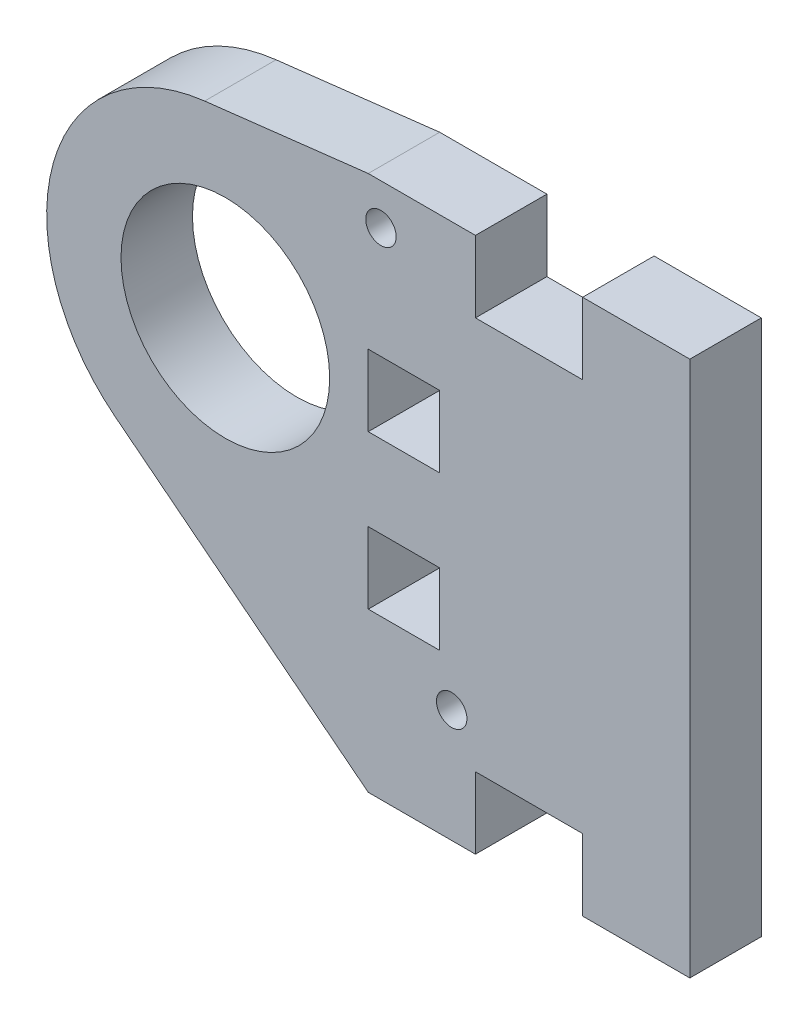
ISO-10303-21;
HEADER;
FILE_DESCRIPTION(('STEP AP214'),'2;1');
FILE_NAME('part.step','',(''),(''),'','','');
FILE_SCHEMA(('AUTOMOTIVE_DESIGN { 1 0 10303 214 1 1 1 1 }'));
ENDSEC;
DATA;
#1=APPLICATION_CONTEXT('core data for automotive mechanical design processes');
#2=APPLICATION_PROTOCOL_DEFINITION('international standard','automotive_design',2000,#1);
#3=PRODUCT_CONTEXT('',#1,'mechanical');
#4=PRODUCT('Part','Part','',(#3));
#5=PRODUCT_RELATED_PRODUCT_CATEGORY('part','',(#4));
#6=PRODUCT_DEFINITION_FORMATION('','',#4);
#7=PRODUCT_DEFINITION_CONTEXT('part definition',#1,'design');
#8=PRODUCT_DEFINITION('design','',#6,#7);
#9=PRODUCT_DEFINITION_SHAPE('','',#8);
#10=(LENGTH_UNIT() NAMED_UNIT(*) SI_UNIT(.MILLI.,.METRE.));
#11=(NAMED_UNIT(*) PLANE_ANGLE_UNIT() SI_UNIT($,.RADIAN.));
#12=(NAMED_UNIT(*) SI_UNIT($,.STERADIAN.) SOLID_ANGLE_UNIT());
#13=UNCERTAINTY_MEASURE_WITH_UNIT(LENGTH_MEASURE(1.E-05),#10,'distance_accuracy_value','');
#14=(GEOMETRIC_REPRESENTATION_CONTEXT(3) GLOBAL_UNCERTAINTY_ASSIGNED_CONTEXT((#13)) GLOBAL_UNIT_ASSIGNED_CONTEXT((#10,
#11,#12)) REPRESENTATION_CONTEXT('',''));
#15=CARTESIAN_POINT('',(0.,0.,0.));
#16=DIRECTION('',(0.,0.,1.));
#17=DIRECTION('',(1.,0.,0.));
#18=AXIS2_PLACEMENT_3D('',#15,#16,#17);
#19=CARTESIAN_POINT('',(3.34833341349612,-17.0927266242928,6.35));
#20=DIRECTION('',(0.,1.,0.));
#21=DIRECTION('',(-1.,0.,0.));
#22=AXIS2_PLACEMENT_3D('',#19,#20,#21);
#23=PLANE('',#22);
#24=DIRECTION('',(1.,0.,0.));
#25=VECTOR('',#24,1.);
#26=CARTESIAN_POINT('',(3.34833341349612,-17.0927266242928,6.35));
#27=LINE('',#26,#25);
#28=CARTESIAN_POINT('',(22.3983334134961,-17.0927266242928,6.35));
#29=VERTEX_POINT('',#28);
#30=CARTESIAN_POINT('',(31.9233334134961,-17.0927266242928,6.35));
#31=VERTEX_POINT('',#30);
#32=EDGE_CURVE('E327',#29,#31,#27,.T.);
#33=ORIENTED_EDGE('',*,*,#32,.F.);
#34=DIRECTION('',(0.,0.,-1.));
#35=VECTOR('',#34,1.);
#36=CARTESIAN_POINT('',(22.3983334134961,-17.0927266242928,6.35));
#37=LINE('',#36,#35);
#38=CARTESIAN_POINT('',(22.3983334134961,-17.0927266242928,0.));
#39=VERTEX_POINT('',#38);
#40=EDGE_CURVE('E279',#29,#39,#37,.T.);
#41=ORIENTED_EDGE('',*,*,#40,.T.);
#42=DIRECTION('',(1.,0.,0.));
#43=VECTOR('',#42,1.);
#44=CARTESIAN_POINT('',(3.34833341349612,-17.0927266242928,0.));
#45=LINE('',#44,#43);
#46=CARTESIAN_POINT('',(31.9233334134961,-17.0927266242928,0.));
#47=VERTEX_POINT('',#46);
#48=EDGE_CURVE('E344',#39,#47,#45,.T.);
#49=ORIENTED_EDGE('',*,*,#48,.T.);
#50=DIRECTION('',(0.,0.,-1.));
#51=VECTOR('',#50,1.);
#52=CARTESIAN_POINT('',(31.9233334134961,-17.0927266242928,6.35));
#53=LINE('',#52,#51);
#54=EDGE_CURVE('E331',#31,#47,#53,.T.);
#55=ORIENTED_EDGE('',*,*,#54,.F.);
#56=EDGE_LOOP('',(#33,#41,#49,#55));
#57=FACE_BOUND('',#56,.T.);
#58=ADVANCED_FACE('F39',(#57),#23,.F.);
#59=CARTESIAN_POINT('',(3.34833341349612,30.5322733757072,6.35));
#60=DIRECTION('',(0.,-1.,0.));
#61=DIRECTION('',(0.,0.,-1.));
#62=AXIS2_PLACEMENT_3D('',#59,#60,#61);
#63=PLANE('',#62);
#64=DIRECTION('',(-1.,0.,0.));
#65=VECTOR('',#64,1.);
#66=CARTESIAN_POINT('',(3.34833341349612,30.5322733757072,0.));
#67=LINE('',#66,#65);
#68=CARTESIAN_POINT('',(31.9233334134961,30.5322733757072,0.));
#69=VERTEX_POINT('',#68);
#70=CARTESIAN_POINT('',(22.3983334134961,30.5322733757072,0.));
#71=VERTEX_POINT('',#70);
#72=EDGE_CURVE('E335',#69,#71,#67,.T.);
#73=ORIENTED_EDGE('',*,*,#72,.T.);
#74=DIRECTION('',(0.,0.,1.));
#75=VECTOR('',#74,1.);
#76=CARTESIAN_POINT('',(22.3983334134961,30.5322733757072,6.35));
#77=LINE('',#76,#75);
#78=CARTESIAN_POINT('',(22.3983334134961,30.5322733757072,6.35));
#79=VERTEX_POINT('',#78);
#80=EDGE_CURVE('E303',#71,#79,#77,.T.);
#81=ORIENTED_EDGE('',*,*,#80,.T.);
#82=DIRECTION('',(-1.,0.,0.));
#83=VECTOR('',#82,1.);
#84=CARTESIAN_POINT('',(3.34833341349612,30.5322733757072,6.35));
#85=LINE('',#84,#83);
#86=CARTESIAN_POINT('',(31.9233334134961,30.5322733757072,6.35));
#87=VERTEX_POINT('',#86);
#88=EDGE_CURVE('E318',#87,#79,#85,.T.);
#89=ORIENTED_EDGE('',*,*,#88,.F.);
#90=DIRECTION('',(0.,0.,-1.));
#91=VECTOR('',#90,1.);
#92=CARTESIAN_POINT('',(31.9233334134961,30.5322733757072,6.35));
#93=LINE('',#92,#91);
#94=EDGE_CURVE('E361',#87,#69,#93,.T.);
#95=ORIENTED_EDGE('',*,*,#94,.T.);
#96=EDGE_LOOP('',(#73,#81,#89,#95));
#97=FACE_BOUND('',#96,.T.);
#98=ADVANCED_FACE('F393',(#97),#63,.F.);
#99=CARTESIAN_POINT('',(31.9233334134961,-17.0927266242928,6.35));
#100=DIRECTION('',(-1.,0.,0.));
#101=DIRECTION('',(0.,0.,1.));
#102=AXIS2_PLACEMENT_3D('',#99,#100,#101);
#103=PLANE('',#102);
#104=DIRECTION('',(0.,1.,0.));
#105=VECTOR('',#104,1.);
#106=CARTESIAN_POINT('',(31.9233334134961,-17.0927266242928,0.));
#107=LINE('',#106,#105);
#108=EDGE_CURVE('E310',#47,#69,#107,.T.);
#109=ORIENTED_EDGE('',*,*,#108,.T.);
#110=ORIENTED_EDGE('',*,*,#94,.F.);
#111=DIRECTION('',(0.,1.,0.));
#112=VECTOR('',#111,1.);
#113=CARTESIAN_POINT('',(31.9233334134961,-17.0927266242928,6.35));
#114=LINE('',#113,#112);
#115=EDGE_CURVE('E313',#31,#87,#114,.T.);
#116=ORIENTED_EDGE('',*,*,#115,.F.);
#117=ORIENTED_EDGE('',*,*,#54,.T.);
#118=EDGE_LOOP('',(#109,#110,#116,#117));
#119=FACE_BOUND('',#118,.T.);
#120=ADVANCED_FACE('F41',(#119),#103,.F.);
#121=CARTESIAN_POINT('',(12.8733334134961,30.5322733757072,6.35));
#122=VERTEX_POINT('',#121);
#123=CARTESIAN_POINT('',(3.34833341349612,30.5322733757072,6.35));
#124=VERTEX_POINT('',#123);
#125=EDGE_CURVE('E316',#122,#124,#85,.T.);
#126=ORIENTED_EDGE('',*,*,#125,.F.);
#127=DIRECTION('',(0.,0.,-1.));
#128=VECTOR('',#127,1.);
#129=CARTESIAN_POINT('',(12.8733334134961,30.5322733757072,6.35));
#130=LINE('',#129,#128);
#131=CARTESIAN_POINT('',(12.8733334134961,30.5322733757072,0.));
#132=VERTEX_POINT('',#131);
#133=EDGE_CURVE('E299',#122,#132,#130,.T.);
#134=ORIENTED_EDGE('',*,*,#133,.T.);
#135=CARTESIAN_POINT('',(3.34833341349612,30.5322733757072,0.));
#136=VERTEX_POINT('',#135);
#137=EDGE_CURVE('E334',#132,#136,#67,.T.);
#138=ORIENTED_EDGE('',*,*,#137,.T.);
#139=DIRECTION('',(0.,0.,-1.));
#140=VECTOR('',#139,1.);
#141=CARTESIAN_POINT('',(3.34833341349612,30.5322733757072,6.35));
#142=LINE('',#141,#140);
#143=EDGE_CURVE('E358',#124,#136,#142,.T.);
#144=ORIENTED_EDGE('',*,*,#143,.F.);
#145=EDGE_LOOP('',(#126,#134,#138,#144));
#146=FACE_BOUND('',#145,.T.);
#147=ADVANCED_FACE('F401',(#146),#63,.F.);
#148=CARTESIAN_POINT('',(3.34833341349612,30.5322733757072,6.35));
#149=DIRECTION('',(0.115756697460658,-0.993277598153206,0.));
#150=DIRECTION('',(0.993277598153206,0.115756697460658,0.));
#151=AXIS2_PLACEMENT_3D('',#148,#149,#150);
#152=PLANE('',#151);
#153=DIRECTION('',(-0.993277598153206,-0.115756697460658,0.));
#154=VECTOR('',#153,1.);
#155=CARTESIAN_POINT('',(3.34833341349612,30.5322733757072,0.));
#156=LINE('',#155,#154);
#157=CARTESIAN_POINT('',(-11.1893041586918,28.8380552463894,0.));
#158=VERTEX_POINT('',#157);
#159=EDGE_CURVE('E338',#136,#158,#156,.T.);
#160=ORIENTED_EDGE('',*,*,#159,.T.);
#161=DIRECTION('',(0.,0.,-1.));
#162=VECTOR('',#161,1.);
#163=CARTESIAN_POINT('',(-11.1893041586918,28.8380552463894,6.35));
#164=LINE('',#163,#162);
#165=CARTESIAN_POINT('',(-11.1893041586918,28.8380552463894,6.35));
#166=VERTEX_POINT('',#165);
#167=EDGE_CURVE('E355',#166,#158,#164,.T.);
#168=ORIENTED_EDGE('',*,*,#167,.F.);
#169=DIRECTION('',(-0.993277598153206,-0.115756697460658,0.));
#170=VECTOR('',#169,1.);
#171=CARTESIAN_POINT('',(3.34833341349612,30.5322733757072,6.35));
#172=LINE('',#171,#170);
#173=EDGE_CURVE('E321',#124,#166,#172,.T.);
#174=ORIENTED_EDGE('',*,*,#173,.F.);
#175=ORIENTED_EDGE('',*,*,#143,.T.);
#176=EDGE_LOOP('',(#160,#168,#174,#175));
#177=FACE_BOUND('',#176,.T.);
#178=ADVANCED_FACE('F441',(#177),#152,.F.);
#179=CARTESIAN_POINT('',(-9.35166658650387,13.0697733757072,6.35));
#180=DIRECTION('',(0.,0.,-1.));
#181=DIRECTION('',(-1.,0.,0.));
#182=AXIS2_PLACEMENT_3D('',#179,#180,#181);
#183=CYLINDRICAL_SURFACE('',#182,15.875);
#184=CARTESIAN_POINT('',(-9.35166658650387,13.0697733757072,0.));
#185=DIRECTION('',(0.,0.,1.));
#186=DIRECTION('',(1.,0.,0.));
#187=AXIS2_PLACEMENT_3D('',#184,#185,#186);
#188=CIRCLE('',#187,15.875);
#189=CARTESIAN_POINT('',(-19.1578360389959,0.585596764131632,0.));
#190=VERTEX_POINT('',#189);
#191=EDGE_CURVE('E340',#158,#190,#188,.T.);
#192=ORIENTED_EDGE('',*,*,#191,.T.);
#193=DIRECTION('',(0.,0.,-1.));
#194=VECTOR('',#193,1.);
#195=CARTESIAN_POINT('',(-19.1578360389959,0.585596764131632,6.35));
#196=LINE('',#195,#194);
#197=CARTESIAN_POINT('',(-19.1578360389959,0.585596764131632,6.35));
#198=VERTEX_POINT('',#197);
#199=EDGE_CURVE('E352',#198,#190,#196,.T.);
#200=ORIENTED_EDGE('',*,*,#199,.F.);
#201=CARTESIAN_POINT('',(-9.35166658650387,13.0697733757072,6.35));
#202=DIRECTION('',(0.,0.,1.));
#203=DIRECTION('',(1.,0.,0.));
#204=AXIS2_PLACEMENT_3D('',#201,#202,#203);
#205=CIRCLE('',#204,15.875);
#206=EDGE_CURVE('E323',#166,#198,#205,.T.);
#207=ORIENTED_EDGE('',*,*,#206,.F.);
#208=ORIENTED_EDGE('',*,*,#167,.T.);
#209=EDGE_LOOP('',(#192,#200,#207,#208));
#210=FACE_BOUND('',#209,.T.);
#211=ADVANCED_FACE('F414',(#210),#183,.T.);
#212=CARTESIAN_POINT('',(3.34833341349612,-17.0927266242928,6.35));
#213=DIRECTION('',(0.617711461574303,0.786404825926023,0.));
#214=DIRECTION('',(-0.786404825926023,0.617711461574303,0.));
#215=AXIS2_PLACEMENT_3D('',#212,#213,#214);
#216=PLANE('',#215);
#217=DIRECTION('',(0.786404825926023,-0.617711461574303,0.));
#218=VECTOR('',#217,1.);
#219=CARTESIAN_POINT('',(3.34833341349612,-17.0927266242928,0.));
#220=LINE('',#219,#218);
#221=CARTESIAN_POINT('',(3.34833341349612,-17.0927266242928,0.));
#222=VERTEX_POINT('',#221);
#223=EDGE_CURVE('E342',#190,#222,#220,.T.);
#224=ORIENTED_EDGE('',*,*,#223,.T.);
#225=DIRECTION('',(0.,0.,-1.));
#226=VECTOR('',#225,1.);
#227=CARTESIAN_POINT('',(3.34833341349612,-17.0927266242928,6.35));
#228=LINE('',#227,#226);
#229=CARTESIAN_POINT('',(3.34833341349612,-17.0927266242928,6.35));
#230=VERTEX_POINT('',#229);
#231=EDGE_CURVE('E349',#230,#222,#228,.T.);
#232=ORIENTED_EDGE('',*,*,#231,.F.);
#233=DIRECTION('',(0.786404825926023,-0.617711461574303,0.));
#234=VECTOR('',#233,1.);
#235=CARTESIAN_POINT('',(3.34833341349612,-17.0927266242928,6.35));
#236=LINE('',#235,#234);
#237=EDGE_CURVE('E325',#198,#230,#236,.T.);
#238=ORIENTED_EDGE('',*,*,#237,.F.);
#239=ORIENTED_EDGE('',*,*,#199,.T.);
#240=EDGE_LOOP('',(#224,#232,#238,#239));
#241=FACE_BOUND('',#240,.T.);
#242=ADVANCED_FACE('F406',(#241),#216,.F.);
#243=CARTESIAN_POINT('',(12.8733334134961,-17.0927266242928,0.));
#244=VERTEX_POINT('',#243);
#245=EDGE_CURVE('E317',#222,#244,#45,.T.);
#246=ORIENTED_EDGE('',*,*,#245,.T.);
#247=DIRECTION('',(0.,0.,1.));
#248=VECTOR('',#247,1.);
#249=CARTESIAN_POINT('',(12.8733334134961,-17.0927266242928,6.35));
#250=LINE('',#249,#248);
#251=CARTESIAN_POINT('',(12.8733334134961,-17.0927266242928,6.35));
#252=VERTEX_POINT('',#251);
#253=EDGE_CURVE('E274',#244,#252,#250,.T.);
#254=ORIENTED_EDGE('',*,*,#253,.T.);
#255=EDGE_CURVE('E328',#230,#252,#27,.T.);
#256=ORIENTED_EDGE('',*,*,#255,.F.);
#257=ORIENTED_EDGE('',*,*,#231,.T.);
#258=EDGE_LOOP('',(#246,#254,#256,#257));
#259=FACE_BOUND('',#258,.T.);
#260=ADVANCED_FACE('F396',(#259),#23,.F.);
#261=CARTESIAN_POINT('',(-9.35166658650387,13.0697733757072,6.35));
#262=DIRECTION('',(0.,0.,1.));
#263=DIRECTION('',(1.,0.,0.));
#264=AXIS2_PLACEMENT_3D('',#261,#262,#263);
#265=PLANE('',#264);
#266=DIRECTION('',(-1.,0.,0.));
#267=VECTOR('',#266,1.);
#268=CARTESIAN_POINT('',(9.69833341559938,-2.99416562889744,6.35000000011268));
#269=LINE('',#268,#267);
#270=CARTESIAN_POINT('',(9.69833341559938,-2.99416562889744,6.35000000011268));
#271=VERTEX_POINT('',#270);
#272=CARTESIAN_POINT('',(3.34833341559938,-2.99416562889744,6.35000000011268));
#273=VERTEX_POINT('',#272);
#274=EDGE_CURVE('E233',#271,#273,#269,.T.);
#275=ORIENTED_EDGE('',*,*,#274,.T.);
#276=DIRECTION('',(0.,1.,0.));
#277=VECTOR('',#276,1.);
#278=CARTESIAN_POINT('',(3.34833341559938,3.35583437110256,6.35000000011268));
#279=LINE('',#278,#277);
#280=CARTESIAN_POINT('',(3.34833341559938,3.35583437110256,6.35000000011268));
#281=VERTEX_POINT('',#280);
#282=EDGE_CURVE('E235',#273,#281,#279,.T.);
#283=ORIENTED_EDGE('',*,*,#282,.T.);
#284=DIRECTION('',(-1.,0.,0.));
#285=VECTOR('',#284,1.);
#286=CARTESIAN_POINT('',(9.69833341559938,3.35583437110256,6.35000000011268));
#287=LINE('',#286,#285);
#288=CARTESIAN_POINT('',(9.69833341559938,3.35583437110256,6.35));
#289=VERTEX_POINT('',#288);
#290=EDGE_CURVE('E239',#289,#281,#287,.T.);
#291=ORIENTED_EDGE('',*,*,#290,.F.);
#292=DIRECTION('',(0.,1.,0.));
#293=VECTOR('',#292,1.);
#294=CARTESIAN_POINT('',(9.69833341559938,3.35583437110256,6.35000000011268));
#295=LINE('',#294,#293);
#296=EDGE_CURVE('E54',#271,#289,#295,.T.);
#297=ORIENTED_EDGE('',*,*,#296,.F.);
#298=EDGE_LOOP('',(#275,#283,#291,#297));
#299=FACE_BOUND('',#298,.T.);
#300=DIRECTION('',(-1.,0.,0.));
#301=VECTOR('',#300,1.);
#302=CARTESIAN_POINT('',(9.69833341559938,17.0128062099298,6.35000000011271));
#303=LINE('',#302,#301);
#304=CARTESIAN_POINT('',(9.69833341559938,17.0128062099298,6.35000000011271));
#305=VERTEX_POINT('',#304);
#306=CARTESIAN_POINT('',(3.34833341559938,17.0128062099298,6.35000000011271));
#307=VERTEX_POINT('',#306);
#308=EDGE_CURVE('E209',#305,#307,#303,.T.);
#309=ORIENTED_EDGE('',*,*,#308,.F.);
#310=DIRECTION('',(0.,1.,0.));
#311=VECTOR('',#310,1.);
#312=CARTESIAN_POINT('',(9.69833341559938,10.6628062099298,6.35000000011271));
#313=LINE('',#312,#311);
#314=CARTESIAN_POINT('',(9.69833341559938,10.6628062099298,6.35000000011271));
#315=VERTEX_POINT('',#314);
#316=EDGE_CURVE('E196',#315,#305,#313,.T.);
#317=ORIENTED_EDGE('',*,*,#316,.F.);
#318=DIRECTION('',(-1.,0.,0.));
#319=VECTOR('',#318,1.);
#320=CARTESIAN_POINT('',(9.69833341559938,10.6628062099298,6.35000000011271));
#321=LINE('',#320,#319);
#322=CARTESIAN_POINT('',(3.34833341559937,10.6628062099298,6.35));
#323=VERTEX_POINT('',#322);
#324=EDGE_CURVE('E205',#315,#323,#321,.T.);
#325=ORIENTED_EDGE('',*,*,#324,.T.);
#326=DIRECTION('',(0.,1.,0.));
#327=VECTOR('',#326,1.);
#328=CARTESIAN_POINT('',(3.34833341559938,10.6628062099298,6.35000000011271));
#329=LINE('',#328,#327);
#330=EDGE_CURVE('E62',#323,#307,#329,.T.);
#331=ORIENTED_EDGE('',*,*,#330,.T.);
#332=EDGE_LOOP('',(#309,#317,#325,#331));
#333=FACE_BOUND('',#332,.T.);
#334=CARTESIAN_POINT('',(10.764107124691,-7.04600033548769,6.35));
#335=DIRECTION('',(0.,0.,1.));
#336=DIRECTION('',(1.,0.,0.));
#337=AXIS2_PLACEMENT_3D('',#334,#335,#336);
#338=CIRCLE('',#337,1.35254999999999);
#339=CARTESIAN_POINT('',(12.116657124691,-7.04600033548769,6.35));
#340=VERTEX_POINT('',#339);
#341=EDGE_CURVE('E249',#340,#340,#338,.T.);
#342=ORIENTED_EDGE('',*,*,#341,.F.);
#343=EDGE_LOOP('',(#342));
#344=FACE_BOUND('',#343,.T.);
#345=CARTESIAN_POINT('',(4.47792783994259,26.8993678021538,6.35));
#346=DIRECTION('',(0.,0.,1.));
#347=DIRECTION('',(1.,0.,0.));
#348=AXIS2_PLACEMENT_3D('',#345,#346,#347);
#349=CIRCLE('',#348,1.35254999999999);
#350=CARTESIAN_POINT('',(5.83047783994258,26.8993678021538,6.35));
#351=VERTEX_POINT('',#350);
#352=EDGE_CURVE('E253',#351,#351,#349,.T.);
#353=ORIENTED_EDGE('',*,*,#352,.F.);
#354=EDGE_LOOP('',(#353));
#355=FACE_BOUND('',#354,.T.);
#356=DIRECTION('',(0.,-1.,0.));
#357=VECTOR('',#356,1.);
#358=CARTESIAN_POINT('',(22.3983334134961,-23.4427266242927,6.35));
#359=LINE('',#358,#357);
#360=CARTESIAN_POINT('',(22.3983334134961,-10.7427266242928,6.35));
#361=VERTEX_POINT('',#360);
#362=EDGE_CURVE('E257',#361,#29,#359,.T.);
#363=ORIENTED_EDGE('',*,*,#362,.T.);
#364=ORIENTED_EDGE('',*,*,#32,.T.);
#365=ORIENTED_EDGE('',*,*,#115,.T.);
#366=ORIENTED_EDGE('',*,*,#88,.T.);
#367=DIRECTION('',(0.,-1.,0.));
#368=VECTOR('',#367,1.);
#369=CARTESIAN_POINT('',(22.3983334134961,24.1822733757072,6.35));
#370=LINE('',#369,#368);
#371=CARTESIAN_POINT('',(22.3983334134961,24.1822733757072,6.35));
#372=VERTEX_POINT('',#371);
#373=EDGE_CURVE('E283',#79,#372,#370,.T.);
#374=ORIENTED_EDGE('',*,*,#373,.T.);
#375=DIRECTION('',(-1.,0.,0.));
#376=VECTOR('',#375,1.);
#377=CARTESIAN_POINT('',(12.8733334134961,24.1822733757073,6.35));
#378=LINE('',#377,#376);
#379=CARTESIAN_POINT('',(12.8733334134961,24.1822733757073,6.35));
#380=VERTEX_POINT('',#379);
#381=EDGE_CURVE('E286',#372,#380,#378,.T.);
#382=ORIENTED_EDGE('',*,*,#381,.T.);
#383=DIRECTION('',(0.,1.,0.));
#384=VECTOR('',#383,1.);
#385=CARTESIAN_POINT('',(12.8733334134961,24.1822733757073,6.35));
#386=LINE('',#385,#384);
#387=EDGE_CURVE('E290',#380,#122,#386,.T.);
#388=ORIENTED_EDGE('',*,*,#387,.T.);
#389=ORIENTED_EDGE('',*,*,#125,.T.);
#390=ORIENTED_EDGE('',*,*,#173,.T.);
#391=ORIENTED_EDGE('',*,*,#206,.T.);
#392=ORIENTED_EDGE('',*,*,#237,.T.);
#393=ORIENTED_EDGE('',*,*,#255,.T.);
#394=DIRECTION('',(0.,1.,0.));
#395=VECTOR('',#394,1.);
#396=CARTESIAN_POINT('',(12.8733334134961,-23.4427266242927,6.35));
#397=LINE('',#396,#395);
#398=CARTESIAN_POINT('',(12.8733334134961,-10.7427266242928,6.35));
#399=VERTEX_POINT('',#398);
#400=EDGE_CURVE('E260',#252,#399,#397,.T.);
#401=ORIENTED_EDGE('',*,*,#400,.T.);
#402=DIRECTION('',(1.,0.,0.));
#403=VECTOR('',#402,1.);
#404=CARTESIAN_POINT('',(12.8733334134961,-10.7427266242928,6.35));
#405=LINE('',#404,#403);
#406=EDGE_CURVE('E264',#399,#361,#405,.T.);
#407=ORIENTED_EDGE('',*,*,#406,.T.);
#408=EDGE_LOOP('',(#363,#364,#365,#366,#374,#382,#388,#389,#390,#391,#392,#393,#401,#407));
#409=FACE_BOUND('',#408,.T.);
#410=CARTESIAN_POINT('',(-9.35166658650387,13.0697733757072,6.35));
#411=DIRECTION('',(0.,0.,-1.));
#412=DIRECTION('',(-1.,0.,0.));
#413=AXIS2_PLACEMENT_3D('',#410,#411,#412);
#414=CIRCLE('',#413,9.271);
#415=CARTESIAN_POINT('',(-18.6226665865039,13.0697733757072,6.35));
#416=VERTEX_POINT('',#415);
#417=EDGE_CURVE('E307',#416,#416,#414,.T.);
#418=ORIENTED_EDGE('',*,*,#417,.T.);
#419=EDGE_LOOP('',(#418));
#420=FACE_BOUND('',#419,.T.);
#421=ADVANCED_FACE('F211',(#299,#333,#344,#355,#409,#420),#265,.T.);
#422=CARTESIAN_POINT('',(-9.35166658650387,13.0697733757072,0.));
#423=DIRECTION('',(0.,0.,1.));
#424=DIRECTION('',(1.,0.,0.));
#425=AXIS2_PLACEMENT_3D('',#422,#423,#424);
#426=PLANE('',#425);
#427=DIRECTION('',(0.,-1.,0.));
#428=VECTOR('',#427,1.);
#429=CARTESIAN_POINT('',(9.69833341559937,13.0697733757072,0.));
#430=LINE('',#429,#428);
#431=CARTESIAN_POINT('',(9.69833341559937,17.0128062099298,0.));
#432=VERTEX_POINT('',#431);
#433=CARTESIAN_POINT('',(9.69833341559938,10.6628062099298,0.));
#434=VERTEX_POINT('',#433);
#435=EDGE_CURVE('E199',#432,#434,#430,.T.);
#436=ORIENTED_EDGE('',*,*,#435,.F.);
#437=DIRECTION('',(1.,0.,0.));
#438=VECTOR('',#437,1.);
#439=CARTESIAN_POINT('',(9.69833341559937,17.0128062099298,0.));
#440=LINE('',#439,#438);
#441=CARTESIAN_POINT('',(3.34833341559937,17.0128062099298,0.));
#442=VERTEX_POINT('',#441);
#443=EDGE_CURVE('E224',#442,#432,#440,.T.);
#444=ORIENTED_EDGE('',*,*,#443,.F.);
#445=DIRECTION('',(0.,-1.,0.));
#446=VECTOR('',#445,1.);
#447=CARTESIAN_POINT('',(3.34833341559937,13.0697733757072,0.));
#448=LINE('',#447,#446);
#449=CARTESIAN_POINT('',(3.34833341559937,10.6628062099298,0.));
#450=VERTEX_POINT('',#449);
#451=EDGE_CURVE('E11',#442,#450,#448,.T.);
#452=ORIENTED_EDGE('',*,*,#451,.T.);
#453=DIRECTION('',(-1.,0.,0.));
#454=VECTOR('',#453,1.);
#455=CARTESIAN_POINT('',(9.69833341559937,10.6628062099298,0.));
#456=LINE('',#455,#454);
#457=EDGE_CURVE('E221',#434,#450,#456,.T.);
#458=ORIENTED_EDGE('',*,*,#457,.F.);
#459=EDGE_LOOP('',(#436,#444,#452,#458));
#460=FACE_BOUND('',#459,.T.);
#461=CARTESIAN_POINT('',(9.69833341559937,3.35583437110256,0.));
#462=VERTEX_POINT('',#461);
#463=CARTESIAN_POINT('',(9.69833341559937,-2.99416562889744,0.));
#464=VERTEX_POINT('',#463);
#465=EDGE_CURVE('E247',#462,#464,#430,.T.);
#466=ORIENTED_EDGE('',*,*,#465,.F.);
#467=DIRECTION('',(1.,0.,0.));
#468=VECTOR('',#467,1.);
#469=CARTESIAN_POINT('',(9.69833341559937,3.35583437110256,0.));
#470=LINE('',#469,#468);
#471=CARTESIAN_POINT('',(3.34833341559937,3.35583437110256,0.));
#472=VERTEX_POINT('',#471);
#473=EDGE_CURVE('E241',#472,#462,#470,.T.);
#474=ORIENTED_EDGE('',*,*,#473,.F.);
#475=CARTESIAN_POINT('',(3.34833341559937,-2.99416562889744,0.));
#476=VERTEX_POINT('',#475);
#477=EDGE_CURVE('E47',#472,#476,#448,.T.);
#478=ORIENTED_EDGE('',*,*,#477,.T.);
#479=DIRECTION('',(-1.,0.,0.));
#480=VECTOR('',#479,1.);
#481=CARTESIAN_POINT('',(9.69833341559937,-2.99416562889744,0.));
#482=LINE('',#481,#480);
#483=EDGE_CURVE('E245',#464,#476,#482,.T.);
#484=ORIENTED_EDGE('',*,*,#483,.F.);
#485=EDGE_LOOP('',(#466,#474,#478,#484));
#486=FACE_BOUND('',#485,.T.);
#487=CARTESIAN_POINT('',(10.764107124691,-7.04600033548769,0.));
#488=DIRECTION('',(0.,0.,1.));
#489=DIRECTION('',(1.,0.,0.));
#490=AXIS2_PLACEMENT_3D('',#487,#488,#489);
#491=CIRCLE('',#490,1.35254999999998);
#492=CARTESIAN_POINT('',(12.116657124691,-7.04600033548769,0.));
#493=VERTEX_POINT('',#492);
#494=EDGE_CURVE('E252',#493,#493,#491,.T.);
#495=ORIENTED_EDGE('',*,*,#494,.T.);
#496=EDGE_LOOP('',(#495));
#497=FACE_BOUND('',#496,.T.);
#498=ORIENTED_EDGE('',*,*,#48,.F.);
#499=DIRECTION('',(0.,-1.,0.));
#500=VECTOR('',#499,1.);
#501=CARTESIAN_POINT('',(22.3983334134961,-23.4427266242927,0.));
#502=LINE('',#501,#500);
#503=CARTESIAN_POINT('',(22.3983334134961,-10.7427266242928,0.));
#504=VERTEX_POINT('',#503);
#505=EDGE_CURVE('E268',#504,#39,#502,.T.);
#506=ORIENTED_EDGE('',*,*,#505,.F.);
#507=DIRECTION('',(1.,0.,0.));
#508=VECTOR('',#507,1.);
#509=CARTESIAN_POINT('',(12.8733334134961,-10.7427266242928,0.));
#510=LINE('',#509,#508);
#511=CARTESIAN_POINT('',(12.8733334134961,-10.7427266242928,0.));
#512=VERTEX_POINT('',#511);
#513=EDGE_CURVE('E261',#512,#504,#510,.T.);
#514=ORIENTED_EDGE('',*,*,#513,.F.);
#515=DIRECTION('',(0.,-1.,0.));
#516=VECTOR('',#515,1.);
#517=CARTESIAN_POINT('',(12.8733334134961,13.0697733757073,0.));
#518=LINE('',#517,#516);
#519=EDGE_CURVE('E367',#512,#244,#518,.T.);
#520=ORIENTED_EDGE('',*,*,#519,.T.);
#521=ORIENTED_EDGE('',*,*,#245,.F.);
#522=ORIENTED_EDGE('',*,*,#223,.F.);
#523=ORIENTED_EDGE('',*,*,#191,.F.);
#524=ORIENTED_EDGE('',*,*,#159,.F.);
#525=ORIENTED_EDGE('',*,*,#137,.F.);
#526=DIRECTION('',(0.,1.,0.));
#527=VECTOR('',#526,1.);
#528=CARTESIAN_POINT('',(12.8733334134961,24.1822733757073,0.));
#529=LINE('',#528,#527);
#530=CARTESIAN_POINT('',(12.8733334134961,24.1822733757073,0.));
#531=VERTEX_POINT('',#530);
#532=EDGE_CURVE('E287',#531,#132,#529,.T.);
#533=ORIENTED_EDGE('',*,*,#532,.F.);
#534=DIRECTION('',(-1.,0.,0.));
#535=VECTOR('',#534,1.);
#536=CARTESIAN_POINT('',(12.8733334134961,24.1822733757073,0.));
#537=LINE('',#536,#535);
#538=CARTESIAN_POINT('',(22.3983334134961,24.1822733757072,0.));
#539=VERTEX_POINT('',#538);
#540=EDGE_CURVE('E282',#539,#531,#537,.T.);
#541=ORIENTED_EDGE('',*,*,#540,.F.);
#542=DIRECTION('',(0.,1.,0.));
#543=VECTOR('',#542,1.);
#544=CARTESIAN_POINT('',(22.3983334134961,13.0697733757072,0.));
#545=LINE('',#544,#543);
#546=EDGE_CURVE('E364',#539,#71,#545,.T.);
#547=ORIENTED_EDGE('',*,*,#546,.T.);
#548=ORIENTED_EDGE('',*,*,#72,.F.);
#549=ORIENTED_EDGE('',*,*,#108,.F.);
#550=EDGE_LOOP('',(#498,#506,#514,#520,#521,#522,#523,#524,#525,#533,#541,#547,#548,#549));
#551=FACE_BOUND('',#550,.T.);
#552=CARTESIAN_POINT('',(-9.35166658650387,13.0697733757072,0.));
#553=DIRECTION('',(0.,0.,-1.));
#554=DIRECTION('',(-1.,0.,0.));
#555=AXIS2_PLACEMENT_3D('',#552,#553,#554);
#556=CIRCLE('',#555,9.271);
#557=CARTESIAN_POINT('',(-18.6226665865039,13.0697733757072,0.));
#558=VERTEX_POINT('',#557);
#559=EDGE_CURVE('E306',#558,#558,#556,.T.);
#560=ORIENTED_EDGE('',*,*,#559,.F.);
#561=EDGE_LOOP('',(#560));
#562=FACE_BOUND('',#561,.T.);
#563=CARTESIAN_POINT('',(4.47792783994259,26.8993678021538,0.));
#564=DIRECTION('',(0.,0.,1.));
#565=DIRECTION('',(1.,0.,0.));
#566=AXIS2_PLACEMENT_3D('',#563,#564,#565);
#567=CIRCLE('',#566,1.35254999999998);
#568=CARTESIAN_POINT('',(5.83047783994257,26.8993678021538,0.));
#569=VERTEX_POINT('',#568);
#570=EDGE_CURVE('E256',#569,#569,#567,.T.);
#571=ORIENTED_EDGE('',*,*,#570,.T.);
#572=EDGE_LOOP('',(#571));
#573=FACE_BOUND('',#572,.T.);
#574=ADVANCED_FACE('F374',(#460,#486,#497,#551,#562,#573),#426,.F.);
#575=CARTESIAN_POINT('',(-9.35166658650387,13.0697733757072,6.35));
#576=DIRECTION('',(0.,0.,-1.));
#577=DIRECTION('',(-1.,0.,0.));
#578=AXIS2_PLACEMENT_3D('',#575,#576,#577);
#579=CYLINDRICAL_SURFACE('',#578,9.271);
#580=ORIENTED_EDGE('',*,*,#417,.F.);
#581=EDGE_LOOP('',(#580));
#582=FACE_BOUND('',#581,.T.);
#583=ORIENTED_EDGE('',*,*,#559,.T.);
#584=EDGE_LOOP('',(#583));
#585=FACE_BOUND('',#584,.T.);
#586=ADVANCED_FACE('F477',(#582,#585),#579,.F.);
#587=CARTESIAN_POINT('',(22.3983334134961,24.1822733757072,6.35));
#588=DIRECTION('',(1.,0.,0.));
#589=DIRECTION('',(0.,0.,-1.));
#590=AXIS2_PLACEMENT_3D('',#587,#588,#589);
#591=PLANE('',#590);
#592=ORIENTED_EDGE('',*,*,#546,.F.);
#593=DIRECTION('',(0.,0.,-1.));
#594=VECTOR('',#593,1.);
#595=CARTESIAN_POINT('',(22.3983334134961,24.1822733757072,6.35));
#596=LINE('',#595,#594);
#597=EDGE_CURVE('E293',#372,#539,#596,.T.);
#598=ORIENTED_EDGE('',*,*,#597,.F.);
#599=ORIENTED_EDGE('',*,*,#373,.F.);
#600=ORIENTED_EDGE('',*,*,#80,.F.);
#601=EDGE_LOOP('',(#592,#598,#599,#600));
#602=FACE_BOUND('',#601,.T.);
#603=ADVANCED_FACE('F473',(#602),#591,.F.);
#604=CARTESIAN_POINT('',(12.8733334134961,24.1822733757073,6.35));
#605=DIRECTION('',(-1.,0.,0.));
#606=DIRECTION('',(0.,-1.,0.));
#607=AXIS2_PLACEMENT_3D('',#604,#605,#606);
#608=PLANE('',#607);
#609=ORIENTED_EDGE('',*,*,#387,.F.);
#610=DIRECTION('',(0.,0.,-1.));
#611=VECTOR('',#610,1.);
#612=CARTESIAN_POINT('',(12.8733334134961,24.1822733757073,6.35));
#613=LINE('',#612,#611);
#614=EDGE_CURVE('E297',#380,#531,#613,.T.);
#615=ORIENTED_EDGE('',*,*,#614,.T.);
#616=ORIENTED_EDGE('',*,*,#532,.T.);
#617=ORIENTED_EDGE('',*,*,#133,.F.);
#618=EDGE_LOOP('',(#609,#615,#616,#617));
#619=FACE_BOUND('',#618,.T.);
#620=ADVANCED_FACE('F448',(#619),#608,.F.);
#621=CARTESIAN_POINT('',(12.8733334134961,24.1822733757073,6.35));
#622=DIRECTION('',(0.,-1.,0.));
#623=DIRECTION('',(1.,0.,0.));
#624=AXIS2_PLACEMENT_3D('',#621,#622,#623);
#625=PLANE('',#624);
#626=ORIENTED_EDGE('',*,*,#540,.T.);
#627=ORIENTED_EDGE('',*,*,#614,.F.);
#628=ORIENTED_EDGE('',*,*,#381,.F.);
#629=ORIENTED_EDGE('',*,*,#597,.T.);
#630=EDGE_LOOP('',(#626,#627,#628,#629));
#631=FACE_BOUND('',#630,.T.);
#632=ADVANCED_FACE('F451',(#631),#625,.F.);
#633=CARTESIAN_POINT('',(22.3983334134961,-23.4427266242927,6.35));
#634=DIRECTION('',(1.,0.,0.));
#635=DIRECTION('',(0.,0.,-1.));
#636=AXIS2_PLACEMENT_3D('',#633,#634,#635);
#637=PLANE('',#636);
#638=ORIENTED_EDGE('',*,*,#362,.F.);
#639=DIRECTION('',(0.,0.,-1.));
#640=VECTOR('',#639,1.);
#641=CARTESIAN_POINT('',(22.3983334134961,-10.7427266242928,6.35));
#642=LINE('',#641,#640);
#643=EDGE_CURVE('E272',#361,#504,#642,.T.);
#644=ORIENTED_EDGE('',*,*,#643,.T.);
#645=ORIENTED_EDGE('',*,*,#505,.T.);
#646=ORIENTED_EDGE('',*,*,#40,.F.);
#647=EDGE_LOOP('',(#638,#644,#645,#646));
#648=FACE_BOUND('',#647,.T.);
#649=ADVANCED_FACE('F461',(#648),#637,.F.);
#650=CARTESIAN_POINT('',(12.8733334134961,-23.4427266242927,6.35));
#651=DIRECTION('',(-1.,0.,0.));
#652=DIRECTION('',(0.,-1.,0.));
#653=AXIS2_PLACEMENT_3D('',#650,#651,#652);
#654=PLANE('',#653);
#655=ORIENTED_EDGE('',*,*,#519,.F.);
#656=DIRECTION('',(0.,0.,-1.));
#657=VECTOR('',#656,1.);
#658=CARTESIAN_POINT('',(12.8733334134961,-10.7427266242928,6.35));
#659=LINE('',#658,#657);
#660=EDGE_CURVE('E267',#399,#512,#659,.T.);
#661=ORIENTED_EDGE('',*,*,#660,.F.);
#662=ORIENTED_EDGE('',*,*,#400,.F.);
#663=ORIENTED_EDGE('',*,*,#253,.F.);
#664=EDGE_LOOP('',(#655,#661,#662,#663));
#665=FACE_BOUND('',#664,.T.);
#666=ADVANCED_FACE('F426',(#665),#654,.F.);
#667=CARTESIAN_POINT('',(12.8733334134961,-10.7427266242928,6.35));
#668=DIRECTION('',(0.,1.,0.));
#669=DIRECTION('',(0.,0.,1.));
#670=AXIS2_PLACEMENT_3D('',#667,#668,#669);
#671=PLANE('',#670);
#672=ORIENTED_EDGE('',*,*,#513,.T.);
#673=ORIENTED_EDGE('',*,*,#643,.F.);
#674=ORIENTED_EDGE('',*,*,#406,.F.);
#675=ORIENTED_EDGE('',*,*,#660,.T.);
#676=EDGE_LOOP('',(#672,#673,#674,#675));
#677=FACE_BOUND('',#676,.T.);
#678=ADVANCED_FACE('F388',(#677),#671,.F.);
#679=CARTESIAN_POINT('',(4.47792783994259,26.8993678021538,6.35));
#680=DIRECTION('',(0.,0.,1.));
#681=DIRECTION('',(1.,0.,0.));
#682=AXIS2_PLACEMENT_3D('',#679,#680,#681);
#683=CYLINDRICAL_SURFACE('',#682,1.35254999999998);
#684=ORIENTED_EDGE('',*,*,#352,.T.);
#685=EDGE_LOOP('',(#684));
#686=FACE_BOUND('',#685,.T.);
#687=ORIENTED_EDGE('',*,*,#570,.F.);
#688=EDGE_LOOP('',(#687));
#689=FACE_BOUND('',#688,.T.);
#690=ADVANCED_FACE('F379',(#686,#689),#683,.F.);
#691=CARTESIAN_POINT('',(10.764107124691,-7.04600033548769,6.35));
#692=DIRECTION('',(0.,0.,1.));
#693=DIRECTION('',(1.,0.,0.));
#694=AXIS2_PLACEMENT_3D('',#691,#692,#693);
#695=CYLINDRICAL_SURFACE('',#694,1.35254999999998);
#696=ORIENTED_EDGE('',*,*,#341,.T.);
#697=EDGE_LOOP('',(#696));
#698=FACE_BOUND('',#697,.T.);
#699=ORIENTED_EDGE('',*,*,#494,.F.);
#700=EDGE_LOOP('',(#699));
#701=FACE_BOUND('',#700,.T.);
#702=ADVANCED_FACE('F377',(#698,#701),#695,.F.);
#703=CARTESIAN_POINT('',(9.69833341559935,10.6628062099298,-6.35000000011274));
#704=DIRECTION('',(0.,-1.,0.));
#705=DIRECTION('',(-1.,0.,0.));
#706=AXIS2_PLACEMENT_3D('',#703,#704,#705);
#707=PLANE('',#706);
#708=ORIENTED_EDGE('',*,*,#457,.T.);
#709=DIRECTION('',(0.,0.,1.));
#710=VECTOR('',#709,1.);
#711=CARTESIAN_POINT('',(3.34833341559935,10.6628062099298,-6.35000000011274));
#712=LINE('',#711,#710);
#713=EDGE_CURVE('E207',#450,#323,#712,.T.);
#714=ORIENTED_EDGE('',*,*,#713,.T.);
#715=ORIENTED_EDGE('',*,*,#324,.F.);
#716=DIRECTION('',(0.,0.,1.));
#717=VECTOR('',#716,1.);
#718=CARTESIAN_POINT('',(9.69833341559935,10.6628062099298,-6.35000000011274));
#719=LINE('',#718,#717);
#720=EDGE_CURVE('E191',#434,#315,#719,.T.);
#721=ORIENTED_EDGE('',*,*,#720,.F.);
#722=EDGE_LOOP('',(#708,#714,#715,#721));
#723=FACE_BOUND('',#722,.T.);
#724=ADVANCED_FACE('F206',(#723),#707,.F.);
#725=CARTESIAN_POINT('',(9.69833341559935,17.0128062099298,-6.35000000011274));
#726=DIRECTION('',(0.,1.,0.));
#727=DIRECTION('',(1.,0.,0.));
#728=AXIS2_PLACEMENT_3D('',#725,#726,#727);
#729=PLANE('',#728);
#730=ORIENTED_EDGE('',*,*,#443,.T.);
#731=DIRECTION('',(0.,0.,-1.));
#732=VECTOR('',#731,1.);
#733=CARTESIAN_POINT('',(9.69833341559935,17.0128062099298,-6.35000000011274));
#734=LINE('',#733,#732);
#735=EDGE_CURVE('E202',#305,#432,#734,.T.);
#736=ORIENTED_EDGE('',*,*,#735,.F.);
#737=ORIENTED_EDGE('',*,*,#308,.T.);
#738=DIRECTION('',(0.,0.,-1.));
#739=VECTOR('',#738,1.);
#740=CARTESIAN_POINT('',(3.34833341559935,17.0128062099298,-6.35000000011274));
#741=LINE('',#740,#739);
#742=EDGE_CURVE('E216',#307,#442,#741,.T.);
#743=ORIENTED_EDGE('',*,*,#742,.T.);
#744=EDGE_LOOP('',(#730,#736,#737,#743));
#745=FACE_BOUND('',#744,.T.);
#746=ADVANCED_FACE('F386',(#745),#729,.F.);
#747=CARTESIAN_POINT('',(3.34833341559901,30.5322733757072,-170.345082310118));
#748=DIRECTION('',(-1.,0.,0.));
#749=DIRECTION('',(0.,1.,0.));
#750=AXIS2_PLACEMENT_3D('',#747,#748,#749);
#751=PLANE('',#750);
#752=ORIENTED_EDGE('',*,*,#742,.F.);
#753=ORIENTED_EDGE('',*,*,#330,.F.);
#754=ORIENTED_EDGE('',*,*,#713,.F.);
#755=ORIENTED_EDGE('',*,*,#451,.F.);
#756=EDGE_LOOP('',(#752,#753,#754,#755));
#757=FACE_BOUND('',#756,.T.);
#758=ADVANCED_FACE('F505',(#757),#751,.F.);
#759=CARTESIAN_POINT('',(9.69833341559901,30.5322733757072,-170.345082310118));
#760=DIRECTION('',(-1.,0.,0.));
#761=DIRECTION('',(0.,1.,0.));
#762=AXIS2_PLACEMENT_3D('',#759,#760,#761);
#763=PLANE('',#762);
#764=ORIENTED_EDGE('',*,*,#435,.T.);
#765=ORIENTED_EDGE('',*,*,#720,.T.);
#766=ORIENTED_EDGE('',*,*,#316,.T.);
#767=ORIENTED_EDGE('',*,*,#735,.T.);
#768=EDGE_LOOP('',(#764,#765,#766,#767));
#769=FACE_BOUND('',#768,.T.);
#770=ADVANCED_FACE('F193',(#769),#763,.T.);
#771=DIRECTION('',(0.,0.,-1.));
#772=VECTOR('',#771,1.);
#773=CARTESIAN_POINT('',(3.34833341559935,3.35583437110256,-6.35000000011277));
#774=LINE('',#773,#772);
#775=EDGE_CURVE('E229',#281,#472,#774,.T.);
#776=ORIENTED_EDGE('',*,*,#775,.F.);
#777=ORIENTED_EDGE('',*,*,#282,.F.);
#778=DIRECTION('',(0.,0.,1.));
#779=VECTOR('',#778,1.);
#780=CARTESIAN_POINT('',(3.34833341559936,-2.99416562889744,-6.35000000011277));
#781=LINE('',#780,#779);
#782=EDGE_CURVE('E226',#476,#273,#781,.T.);
#783=ORIENTED_EDGE('',*,*,#782,.F.);
#784=ORIENTED_EDGE('',*,*,#477,.F.);
#785=EDGE_LOOP('',(#776,#777,#783,#784));
#786=FACE_BOUND('',#785,.T.);
#787=ADVANCED_FACE('F503',(#786),#751,.F.);
#788=ORIENTED_EDGE('',*,*,#465,.T.);
#789=DIRECTION('',(0.,0.,1.));
#790=VECTOR('',#789,1.);
#791=CARTESIAN_POINT('',(9.69833341559935,-2.99416562889744,-6.35000000011277));
#792=LINE('',#791,#790);
#793=EDGE_CURVE('E227',#464,#271,#792,.T.);
#794=ORIENTED_EDGE('',*,*,#793,.T.);
#795=ORIENTED_EDGE('',*,*,#296,.T.);
#796=DIRECTION('',(0.,0.,-1.));
#797=VECTOR('',#796,1.);
#798=CARTESIAN_POINT('',(9.69833341559935,3.35583437110256,-6.35000000011277));
#799=LINE('',#798,#797);
#800=EDGE_CURVE('E231',#289,#462,#799,.T.);
#801=ORIENTED_EDGE('',*,*,#800,.T.);
#802=EDGE_LOOP('',(#788,#794,#795,#801));
#803=FACE_BOUND('',#802,.T.);
#804=ADVANCED_FACE('F491',(#803),#763,.T.);
#805=CARTESIAN_POINT('',(9.69833341559935,-2.99416562889744,-6.35000000011277));
#806=DIRECTION('',(0.,-1.,0.));
#807=DIRECTION('',(-1.,0.,0.));
#808=AXIS2_PLACEMENT_3D('',#805,#806,#807);
#809=PLANE('',#808);
#810=ORIENTED_EDGE('',*,*,#483,.T.);
#811=ORIENTED_EDGE('',*,*,#782,.T.);
#812=ORIENTED_EDGE('',*,*,#274,.F.);
#813=ORIENTED_EDGE('',*,*,#793,.F.);
#814=EDGE_LOOP('',(#810,#811,#812,#813));
#815=FACE_BOUND('',#814,.T.);
#816=ADVANCED_FACE('F494',(#815),#809,.F.);
#817=CARTESIAN_POINT('',(9.69833341559935,3.35583437110256,-6.35000000011277));
#818=DIRECTION('',(0.,1.,0.));
#819=DIRECTION('',(1.,0.,0.));
#820=AXIS2_PLACEMENT_3D('',#817,#818,#819);
#821=PLANE('',#820);
#822=ORIENTED_EDGE('',*,*,#473,.T.);
#823=ORIENTED_EDGE('',*,*,#800,.F.);
#824=ORIENTED_EDGE('',*,*,#290,.T.);
#825=ORIENTED_EDGE('',*,*,#775,.T.);
#826=EDGE_LOOP('',(#822,#823,#824,#825));
#827=FACE_BOUND('',#826,.T.);
#828=ADVANCED_FACE('F500',(#827),#821,.F.);
#829=CLOSED_SHELL('',(#58,#98,#120,#147,#178,#211,#242,#260,#421,#574,#586,#603,#620,#632,#649,
#666,#678,#690,#702,#724,#746,#758,#770,#787,#804,#816,#828));
#830=MANIFOLD_SOLID_BREP('B2',#829);
#831=ADVANCED_BREP_SHAPE_REPRESENTATION('',(#18,#830),#14);
#832=SHAPE_DEFINITION_REPRESENTATION(#9,#831);
ENDSEC;
END-ISO-10303-21;
